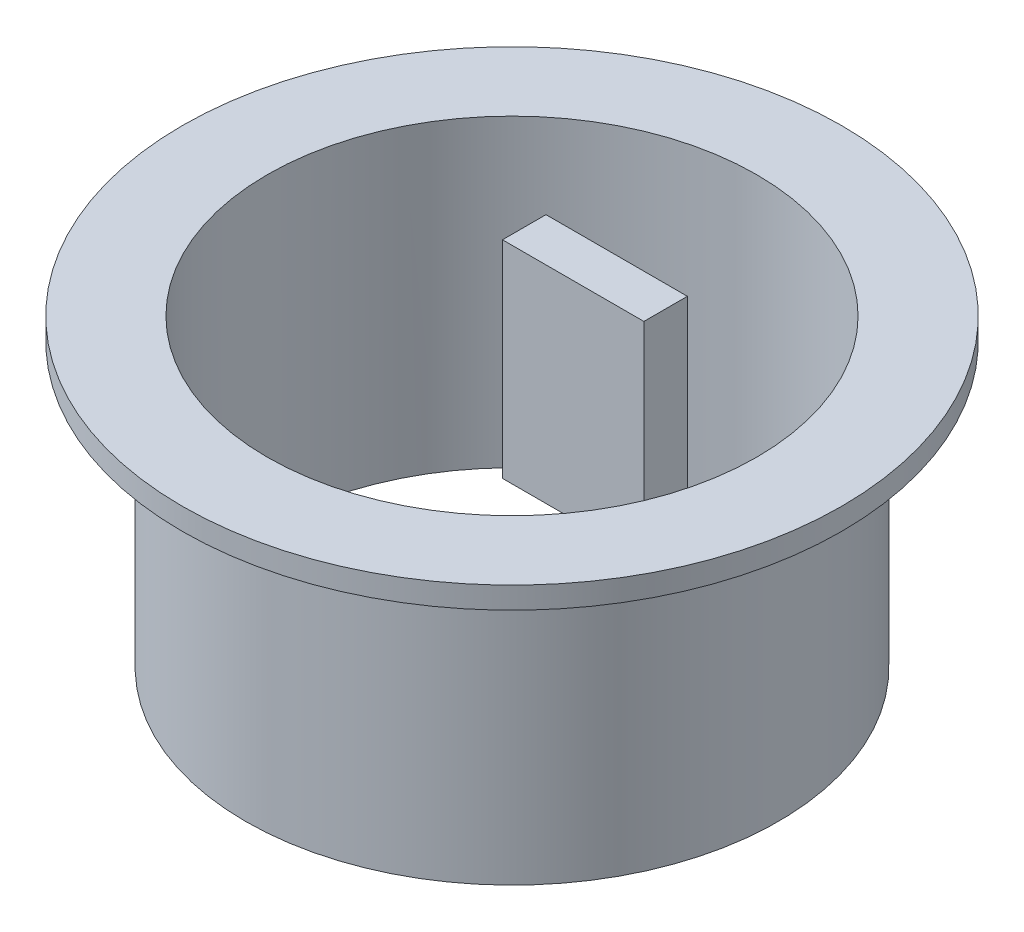
ISO-10303-21;
HEADER;
FILE_DESCRIPTION(('STEP AP214'),'2;1');
FILE_NAME('part.step','',(''),(''),'','','');
FILE_SCHEMA(('AUTOMOTIVE_DESIGN { 1 0 10303 214 1 1 1 1 }'));
ENDSEC;
DATA;
#1=APPLICATION_CONTEXT('core data for automotive mechanical design processes');
#2=APPLICATION_PROTOCOL_DEFINITION('international standard','automotive_design',2000,#1);
#3=PRODUCT_CONTEXT('',#1,'mechanical');
#4=PRODUCT('Part','Part','',(#3));
#5=PRODUCT_RELATED_PRODUCT_CATEGORY('part','',(#4));
#6=PRODUCT_DEFINITION_FORMATION('','',#4);
#7=PRODUCT_DEFINITION_CONTEXT('part definition',#1,'design');
#8=PRODUCT_DEFINITION('design','',#6,#7);
#9=PRODUCT_DEFINITION_SHAPE('','',#8);
#10=(LENGTH_UNIT() NAMED_UNIT(*) SI_UNIT(.MILLI.,.METRE.));
#11=(NAMED_UNIT(*) PLANE_ANGLE_UNIT() SI_UNIT($,.RADIAN.));
#12=(NAMED_UNIT(*) SI_UNIT($,.STERADIAN.) SOLID_ANGLE_UNIT());
#13=UNCERTAINTY_MEASURE_WITH_UNIT(LENGTH_MEASURE(1.E-05),#10,'distance_accuracy_value','');
#14=(GEOMETRIC_REPRESENTATION_CONTEXT(3) GLOBAL_UNCERTAINTY_ASSIGNED_CONTEXT((#13)) GLOBAL_UNIT_ASSIGNED_CONTEXT((#10,
#11,#12)) REPRESENTATION_CONTEXT('',''));
#15=CARTESIAN_POINT('',(0.,0.,0.));
#16=DIRECTION('',(0.,0.,1.));
#17=DIRECTION('',(1.,0.,0.));
#18=AXIS2_PLACEMENT_3D('',#15,#16,#17);
#19=CARTESIAN_POINT('',(13.,-34.,-11.25));
#20=DIRECTION('',(0.,1.,0.));
#21=DIRECTION('',(0.,0.,1.));
#22=AXIS2_PLACEMENT_3D('',#19,#20,#21);
#23=PLANE('',#22);
#24=DIRECTION('',(0.,0.,-1.));
#25=VECTOR('',#24,1.);
#26=CARTESIAN_POINT('',(-13.,-34.,-11.25));
#27=LINE('',#26,#25);
#28=CARTESIAN_POINT('',(-13.,-34.,-11.25));
#29=VERTEX_POINT('',#28);
#30=CARTESIAN_POINT('',(-13.,-34.,-19.25));
#31=VERTEX_POINT('',#30);
#32=EDGE_CURVE('E108',#29,#31,#27,.T.);
#33=ORIENTED_EDGE('',*,*,#32,.T.);
#34=DIRECTION('',(-1.,0.,0.));
#35=VECTOR('',#34,1.);
#36=CARTESIAN_POINT('',(13.,-34.,-19.25));
#37=LINE('',#36,#35);
#38=CARTESIAN_POINT('',(13.,-34.,-19.25));
#39=VERTEX_POINT('',#38);
#40=EDGE_CURVE('E12',#39,#31,#37,.T.);
#41=ORIENTED_EDGE('',*,*,#40,.F.);
#42=DIRECTION('',(0.,0.,-1.));
#43=VECTOR('',#42,1.);
#44=CARTESIAN_POINT('',(13.,-34.,-11.25));
#45=LINE('',#44,#43);
#46=CARTESIAN_POINT('',(13.,-34.,-11.25));
#47=VERTEX_POINT('',#46);
#48=EDGE_CURVE('E94',#47,#39,#45,.T.);
#49=ORIENTED_EDGE('',*,*,#48,.F.);
#50=DIRECTION('',(-1.,0.,0.));
#51=VECTOR('',#50,1.);
#52=CARTESIAN_POINT('',(13.,-34.,-11.25));
#53=LINE('',#52,#51);
#54=EDGE_CURVE('E61',#47,#29,#53,.T.);
#55=ORIENTED_EDGE('',*,*,#54,.T.);
#56=EDGE_LOOP('',(#33,#41,#49,#55));
#57=FACE_BOUND('',#56,.T.);
#58=ADVANCED_FACE('F45',(#57),#23,.F.);
#59=CARTESIAN_POINT('',(13.,-34.,-19.25));
#60=DIRECTION('',(0.,0.,1.));
#61=DIRECTION('',(0.,-1.,0.));
#62=AXIS2_PLACEMENT_3D('',#59,#60,#61);
#63=PLANE('',#62);
#64=DIRECTION('',(0.,1.,0.));
#65=VECTOR('',#64,1.);
#66=CARTESIAN_POINT('',(-13.,-34.,-19.25));
#67=LINE('',#66,#65);
#68=CARTESIAN_POINT('',(-13.,4.,-19.25));
#69=VERTEX_POINT('',#68);
#70=EDGE_CURVE('E99',#31,#69,#67,.T.);
#71=ORIENTED_EDGE('',*,*,#70,.T.);
#72=DIRECTION('',(-1.,0.,0.));
#73=VECTOR('',#72,1.);
#74=CARTESIAN_POINT('',(13.,4.,-19.25));
#75=LINE('',#74,#73);
#76=CARTESIAN_POINT('',(13.,4.,-19.25));
#77=VERTEX_POINT('',#76);
#78=EDGE_CURVE('E53',#77,#69,#75,.T.);
#79=ORIENTED_EDGE('',*,*,#78,.F.);
#80=DIRECTION('',(0.,1.,0.));
#81=VECTOR('',#80,1.);
#82=CARTESIAN_POINT('',(13.,-34.,-19.25));
#83=LINE('',#82,#81);
#84=EDGE_CURVE('E86',#39,#77,#83,.T.);
#85=ORIENTED_EDGE('',*,*,#84,.F.);
#86=ORIENTED_EDGE('',*,*,#40,.T.);
#87=EDGE_LOOP('',(#71,#79,#85,#86));
#88=FACE_BOUND('',#87,.T.);
#89=ADVANCED_FACE('F98',(#88),#63,.F.);
#90=CARTESIAN_POINT('',(13.,4.,-11.25));
#91=DIRECTION('',(0.,1.,0.));
#92=DIRECTION('',(0.,0.,1.));
#93=AXIS2_PLACEMENT_3D('',#90,#91,#92);
#94=PLANE('',#93);
#95=DIRECTION('',(0.,0.,-1.));
#96=VECTOR('',#95,1.);
#97=CARTESIAN_POINT('',(-13.,4.,-11.25));
#98=LINE('',#97,#96);
#99=CARTESIAN_POINT('',(-13.,4.,-11.25));
#100=VERTEX_POINT('',#99);
#101=EDGE_CURVE('E111',#100,#69,#98,.T.);
#102=ORIENTED_EDGE('',*,*,#101,.F.);
#103=DIRECTION('',(-1.,0.,0.));
#104=VECTOR('',#103,1.);
#105=CARTESIAN_POINT('',(13.,4.,-11.25));
#106=LINE('',#105,#104);
#107=CARTESIAN_POINT('',(13.,4.,-11.25));
#108=VERTEX_POINT('',#107);
#109=EDGE_CURVE('E75',#108,#100,#106,.T.);
#110=ORIENTED_EDGE('',*,*,#109,.F.);
#111=DIRECTION('',(0.,0.,-1.));
#112=VECTOR('',#111,1.);
#113=CARTESIAN_POINT('',(13.,4.,-11.25));
#114=LINE('',#113,#112);
#115=EDGE_CURVE('E93',#108,#77,#114,.T.);
#116=ORIENTED_EDGE('',*,*,#115,.T.);
#117=ORIENTED_EDGE('',*,*,#78,.T.);
#118=EDGE_LOOP('',(#102,#110,#116,#117));
#119=FACE_BOUND('',#118,.T.);
#120=ADVANCED_FACE('F102',(#119),#94,.T.);
#121=CARTESIAN_POINT('',(13.,-34.,-11.25));
#122=DIRECTION('',(0.,0.,1.));
#123=DIRECTION('',(1.,0.,0.));
#124=AXIS2_PLACEMENT_3D('',#121,#122,#123);
#125=PLANE('',#124);
#126=DIRECTION('',(0.,1.,0.));
#127=VECTOR('',#126,1.);
#128=CARTESIAN_POINT('',(-13.,-34.,-11.25));
#129=LINE('',#128,#127);
#130=EDGE_CURVE('E113',#29,#100,#129,.T.);
#131=ORIENTED_EDGE('',*,*,#130,.F.);
#132=ORIENTED_EDGE('',*,*,#54,.F.);
#133=DIRECTION('',(0.,1.,0.));
#134=VECTOR('',#133,1.);
#135=CARTESIAN_POINT('',(13.,-34.,-11.25));
#136=LINE('',#135,#134);
#137=EDGE_CURVE('E103',#47,#108,#136,.T.);
#138=ORIENTED_EDGE('',*,*,#137,.T.);
#139=ORIENTED_EDGE('',*,*,#109,.T.);
#140=EDGE_LOOP('',(#131,#132,#138,#139));
#141=FACE_BOUND('',#140,.T.);
#142=ADVANCED_FACE('F119',(#141),#125,.T.);
#143=CARTESIAN_POINT('',(13.,0.,0.));
#144=DIRECTION('',(1.,0.,0.));
#145=DIRECTION('',(0.,0.,-1.));
#146=AXIS2_PLACEMENT_3D('',#143,#144,#145);
#147=PLANE('',#146);
#148=ORIENTED_EDGE('',*,*,#48,.T.);
#149=ORIENTED_EDGE('',*,*,#84,.T.);
#150=ORIENTED_EDGE('',*,*,#115,.F.);
#151=ORIENTED_EDGE('',*,*,#137,.F.);
#152=EDGE_LOOP('',(#148,#149,#150,#151));
#153=FACE_BOUND('',#152,.T.);
#154=ADVANCED_FACE('F90',(#153),#147,.T.);
#155=CARTESIAN_POINT('',(-13.,0.,0.));
#156=DIRECTION('',(1.,0.,0.));
#157=DIRECTION('',(0.,0.,-1.));
#158=AXIS2_PLACEMENT_3D('',#155,#156,#157);
#159=PLANE('',#158);
#160=ORIENTED_EDGE('',*,*,#32,.F.);
#161=ORIENTED_EDGE('',*,*,#130,.T.);
#162=ORIENTED_EDGE('',*,*,#101,.T.);
#163=ORIENTED_EDGE('',*,*,#70,.F.);
#164=EDGE_LOOP('',(#160,#161,#162,#163));
#165=FACE_BOUND('',#164,.T.);
#166=ADVANCED_FACE('F118',(#165),#159,.F.);
#167=CLOSED_SHELL('',(#58,#89,#120,#142,#154,#166));
#168=MANIFOLD_SOLID_BREP('B2',#167);
#169=CARTESIAN_POINT('',(0.,0.,0.));
#170=DIRECTION('',(0.,1.,0.));
#171=DIRECTION('',(0.,0.,1.));
#172=AXIS2_PLACEMENT_3D('',#169,#170,#171);
#173=PLANE('',#172);
#174=CARTESIAN_POINT('',(0.,0.,0.));
#175=DIRECTION('',(0.,1.,0.));
#176=DIRECTION('',(0.,0.,1.));
#177=AXIS2_PLACEMENT_3D('',#174,#175,#176);
#178=CIRCLE('',#177,60.625);
#179=CARTESIAN_POINT('',(0.,0.,60.625));
#180=VERTEX_POINT('',#179);
#181=EDGE_CURVE('E248',#180,#180,#178,.T.);
#182=ORIENTED_EDGE('',*,*,#181,.F.);
#183=EDGE_LOOP('',(#182));
#184=FACE_BOUND('',#183,.T.);
#185=CARTESIAN_POINT('',(0.,0.,0.));
#186=DIRECTION('',(0.,1.,0.));
#187=DIRECTION('',(0.,0.,1.));
#188=AXIS2_PLACEMENT_3D('',#185,#186,#187);
#189=CIRCLE('',#188,49.);
#190=CARTESIAN_POINT('',(0.,0.,49.));
#191=VERTEX_POINT('',#190);
#192=EDGE_CURVE('E252',#191,#191,#189,.F.);
#193=ORIENTED_EDGE('',*,*,#192,.F.);
#194=EDGE_LOOP('',(#193));
#195=FACE_BOUND('',#194,.T.);
#196=ADVANCED_FACE('F169',(#184,#195),#173,.F.);
#197=CARTESIAN_POINT('',(0.,4.,0.));
#198=DIRECTION('',(0.,1.,0.));
#199=DIRECTION('',(0.,0.,1.));
#200=AXIS2_PLACEMENT_3D('',#197,#198,#199);
#201=PLANE('',#200);
#202=CARTESIAN_POINT('',(0.,4.,0.));
#203=DIRECTION('',(0.,1.,0.));
#204=DIRECTION('',(0.,0.,1.));
#205=AXIS2_PLACEMENT_3D('',#202,#203,#204);
#206=CIRCLE('',#205,60.625);
#207=CARTESIAN_POINT('',(0.,4.,60.625));
#208=VERTEX_POINT('',#207);
#209=EDGE_CURVE('E249',#208,#208,#206,.T.);
#210=ORIENTED_EDGE('',*,*,#209,.T.);
#211=EDGE_LOOP('',(#210));
#212=FACE_BOUND('',#211,.T.);
#213=CARTESIAN_POINT('',(0.,4.,0.));
#214=DIRECTION('',(0.,1.,0.));
#215=DIRECTION('',(0.,0.,1.));
#216=AXIS2_PLACEMENT_3D('',#213,#214,#215);
#217=CIRCLE('',#216,45.);
#218=CARTESIAN_POINT('',(0.,4.,45.));
#219=VERTEX_POINT('',#218);
#220=EDGE_CURVE('E245',#219,#219,#217,.T.);
#221=ORIENTED_EDGE('',*,*,#220,.F.);
#222=EDGE_LOOP('',(#221));
#223=FACE_BOUND('',#222,.T.);
#224=ADVANCED_FACE('F275',(#212,#223),#201,.T.);
#225=CARTESIAN_POINT('',(0.,4.,0.));
#226=DIRECTION('',(0.,-1.,0.));
#227=DIRECTION('',(0.,0.,-1.));
#228=AXIS2_PLACEMENT_3D('',#225,#226,#227);
#229=CYLINDRICAL_SURFACE('',#228,60.625);
#230=ORIENTED_EDGE('',*,*,#209,.F.);
#231=EDGE_LOOP('',(#230));
#232=FACE_BOUND('',#231,.T.);
#233=ORIENTED_EDGE('',*,*,#181,.T.);
#234=EDGE_LOOP('',(#233));
#235=FACE_BOUND('',#234,.T.);
#236=ADVANCED_FACE('F171',(#232,#235),#229,.T.);
#237=CARTESIAN_POINT('',(0.,4.,0.));
#238=DIRECTION('',(0.,-1.,0.));
#239=DIRECTION('',(0.,0.,-1.));
#240=AXIS2_PLACEMENT_3D('',#237,#238,#239);
#241=CYLINDRICAL_SURFACE('',#240,45.);
#242=DIRECTION('',(0.,-1.,0.));
#243=VECTOR('',#242,1.);
#244=CARTESIAN_POINT('',(13.,4.,43.081318457076));
#245=LINE('',#244,#243);
#246=CARTESIAN_POINT('',(13.,-24.2896123083659,43.081318457076));
#247=VERTEX_POINT('',#246);
#248=CARTESIAN_POINT('',(13.,-34.,43.081318457076));
#249=VERTEX_POINT('',#248);
#250=EDGE_CURVE('E43',#247,#249,#245,.T.);
#251=ORIENTED_EDGE('',*,*,#250,.F.);
#252=CARTESIAN_POINT('',(0.,-30.7924528301887,0.));
#253=DIRECTION('',(0.,-0.988799086686588,0.149252692330052));
#254=DIRECTION('',(0.,-0.149252692330052,-0.988799086686588));
#255=AXIS2_PLACEMENT_3D('',#252,#253,#254);
#256=ELLIPSE('',#255,45.509750773327,45.);
#257=CARTESIAN_POINT('',(-13.,-24.2896123083659,43.081318457076));
#258=VERTEX_POINT('',#257);
#259=EDGE_CURVE('E186',#247,#258,#256,.T.);
#260=ORIENTED_EDGE('',*,*,#259,.T.);
#261=DIRECTION('',(0.,-1.,0.));
#262=VECTOR('',#261,1.);
#263=CARTESIAN_POINT('',(-13.,4.,43.081318457076));
#264=LINE('',#263,#262);
#265=CARTESIAN_POINT('',(-13.,-34.,43.081318457076));
#266=VERTEX_POINT('',#265);
#267=EDGE_CURVE('E257',#258,#266,#264,.T.);
#268=ORIENTED_EDGE('',*,*,#267,.T.);
#269=CARTESIAN_POINT('',(0.,-34.,0.));
#270=DIRECTION('',(0.,1.,0.));
#271=DIRECTION('',(0.,0.,1.));
#272=AXIS2_PLACEMENT_3D('',#269,#270,#271);
#273=CIRCLE('',#272,45.);
#274=EDGE_CURVE('E177',#266,#249,#273,.T.);
#275=ORIENTED_EDGE('',*,*,#274,.T.);
#276=EDGE_LOOP('',(#251,#260,#268,#275));
#277=FACE_BOUND('',#276,.T.);
#278=ORIENTED_EDGE('',*,*,#220,.T.);
#279=EDGE_LOOP('',(#278));
#280=FACE_BOUND('',#279,.T.);
#281=CARTESIAN_POINT('',(0.,-52.,0.));
#282=DIRECTION('',(0.,-1.,0.));
#283=DIRECTION('',(0.,0.,-1.));
#284=AXIS2_PLACEMENT_3D('',#281,#282,#283);
#285=CIRCLE('',#284,45.);
#286=CARTESIAN_POINT('',(0.,-52.,-45.));
#287=VERTEX_POINT('',#286);
#288=EDGE_CURVE('E227',#287,#287,#285,.T.);
#289=ORIENTED_EDGE('',*,*,#288,.T.);
#290=EDGE_LOOP('',(#289));
#291=FACE_BOUND('',#290,.T.);
#292=ADVANCED_FACE('F259',(#277,#280,#291),#241,.F.);
#293=CARTESIAN_POINT('',(0.,-52.,0.));
#294=DIRECTION('',(0.,-1.,0.));
#295=DIRECTION('',(0.,0.,-1.));
#296=AXIS2_PLACEMENT_3D('',#293,#294,#295);
#297=PLANE('',#296);
#298=CARTESIAN_POINT('',(0.,-52.,0.));
#299=DIRECTION('',(0.,-1.,0.));
#300=DIRECTION('',(0.,0.,-1.));
#301=AXIS2_PLACEMENT_3D('',#298,#299,#300);
#302=CIRCLE('',#301,49.);
#303=CARTESIAN_POINT('',(0.,-52.,49.));
#304=VERTEX_POINT('',#303);
#305=EDGE_CURVE('E242',#304,#304,#302,.T.);
#306=ORIENTED_EDGE('',*,*,#305,.T.);
#307=EDGE_LOOP('',(#306));
#308=FACE_BOUND('',#307,.T.);
#309=ORIENTED_EDGE('',*,*,#288,.F.);
#310=EDGE_LOOP('',(#309));
#311=FACE_BOUND('',#310,.T.);
#312=ADVANCED_FACE('F287',(#308,#311),#297,.T.);
#313=CARTESIAN_POINT('',(0.,-52.,0.));
#314=DIRECTION('',(0.,1.,0.));
#315=DIRECTION('',(0.,0.,1.));
#316=AXIS2_PLACEMENT_3D('',#313,#314,#315);
#317=CYLINDRICAL_SURFACE('',#316,49.);
#318=CARTESIAN_POINT('',(0.,-52.,49.));
#319=CARTESIAN_POINT('',(0.,-51.4583333333333,49.));
#320=CARTESIAN_POINT('',(0.,-50.9166666666667,49.));
#321=CARTESIAN_POINT('',(0.,-49.8333333333333,49.));
#322=CARTESIAN_POINT('',(0.,-49.2916666666667,49.));
#323=CARTESIAN_POINT('',(0.,-48.2083333333333,49.));
#324=CARTESIAN_POINT('',(0.,-47.6666666666667,49.));
#325=CARTESIAN_POINT('',(0.,-46.5833333333333,49.));
#326=CARTESIAN_POINT('',(0.,-46.0416666666667,49.));
#327=CARTESIAN_POINT('',(0.,-44.9583333333333,49.));
#328=CARTESIAN_POINT('',(0.,-44.4166666666667,49.));
#329=CARTESIAN_POINT('',(0.,-43.3333333333333,49.));
#330=CARTESIAN_POINT('',(0.,-42.7916666666667,49.));
#331=CARTESIAN_POINT('',(0.,-41.7083333333333,49.));
#332=CARTESIAN_POINT('',(0.,-41.1666666666667,49.));
#333=CARTESIAN_POINT('',(0.,-40.0833333333333,49.));
#334=CARTESIAN_POINT('',(0.,-39.5416666666667,49.));
#335=CARTESIAN_POINT('',(0.,-38.4583333333333,49.));
#336=CARTESIAN_POINT('',(0.,-37.9166666666667,49.));
#337=CARTESIAN_POINT('',(0.,-36.8333333333333,49.));
#338=CARTESIAN_POINT('',(0.,-36.2916666666667,49.));
#339=CARTESIAN_POINT('',(0.,-35.2083333333333,49.));
#340=CARTESIAN_POINT('',(0.,-34.6666666666667,49.));
#341=CARTESIAN_POINT('',(0.,-33.5833333333333,49.));
#342=CARTESIAN_POINT('',(0.,-33.0416666666667,49.));
#343=CARTESIAN_POINT('',(0.,-31.9583333333333,49.));
#344=CARTESIAN_POINT('',(0.,-31.4166666666667,49.));
#345=CARTESIAN_POINT('',(0.,-30.3333333333333,49.));
#346=CARTESIAN_POINT('',(0.,-29.7916666666667,49.));
#347=CARTESIAN_POINT('',(0.,-28.7083333333333,49.));
#348=CARTESIAN_POINT('',(0.,-28.1666666666667,49.));
#349=CARTESIAN_POINT('',(0.,-27.0833333333333,49.));
#350=CARTESIAN_POINT('',(0.,-26.5416666666667,49.));
#351=CARTESIAN_POINT('',(0.,-25.4583333333333,49.));
#352=CARTESIAN_POINT('',(0.,-24.9166666666667,49.));
#353=CARTESIAN_POINT('',(0.,-23.8333333333333,49.));
#354=CARTESIAN_POINT('',(0.,-23.2916666666667,49.));
#355=CARTESIAN_POINT('',(0.,-22.2083333333333,49.));
#356=CARTESIAN_POINT('',(0.,-21.6666666666667,49.));
#357=CARTESIAN_POINT('',(0.,-20.5833333333333,49.));
#358=CARTESIAN_POINT('',(0.,-20.0416666666667,49.));
#359=CARTESIAN_POINT('',(0.,-18.9583333333333,49.));
#360=CARTESIAN_POINT('',(0.,-18.4166666666667,49.));
#361=CARTESIAN_POINT('',(0.,-17.3333333333333,49.));
#362=CARTESIAN_POINT('',(0.,-16.7916666666667,49.));
#363=CARTESIAN_POINT('',(0.,-15.7083333333333,49.));
#364=CARTESIAN_POINT('',(0.,-15.1666666666667,49.));
#365=CARTESIAN_POINT('',(0.,-14.0833333333333,49.));
#366=CARTESIAN_POINT('',(0.,-13.5416666666667,49.));
#367=CARTESIAN_POINT('',(0.,-12.4583333333333,49.));
#368=CARTESIAN_POINT('',(0.,-11.9166666666667,49.));
#369=CARTESIAN_POINT('',(0.,-10.8333333333333,49.));
#370=CARTESIAN_POINT('',(0.,-10.2916666666667,49.));
#371=CARTESIAN_POINT('',(0.,-9.20833333333333,49.));
#372=CARTESIAN_POINT('',(0.,-8.66666666666667,49.));
#373=CARTESIAN_POINT('',(0.,-7.58333333333333,49.));
#374=CARTESIAN_POINT('',(0.,-7.04166666666667,49.));
#375=CARTESIAN_POINT('',(0.,-5.95833333333333,49.));
#376=CARTESIAN_POINT('',(0.,-5.41666666666667,49.));
#377=CARTESIAN_POINT('',(0.,-4.33333333333333,49.));
#378=CARTESIAN_POINT('',(0.,-3.79166666666667,49.));
#379=CARTESIAN_POINT('',(0.,-2.70833333333334,49.));
#380=CARTESIAN_POINT('',(0.,-2.16666666666667,49.));
#381=CARTESIAN_POINT('',(0.,-1.08333333333333,49.));
#382=CARTESIAN_POINT('',(0.,-0.541666666666667,49.));
#383=CARTESIAN_POINT('',(0.,0.,49.));
#384=B_SPLINE_CURVE_WITH_KNOTS('',3,(#318,#319,#320,#321,#322,#323,#324,#325,#326,#327,#328,
#329,#330,#331,#332,#333,#334,#335,#336,#337,#338,#339,#340,#341,#342,#343,#344,#345,#346,#347,
#348,#349,#350,#351,#352,#353,#354,#355,#356,#357,#358,#359,#360,#361,#362,#363,#364,#365,#366,
#367,#368,#369,#370,#371,#372,#373,#374,#375,#376,#377,#378,#379,#380,#381,#382,#383),
.UNSPECIFIED.,.F.,.F.,(4,2,2,2,2,2,2,2,2,2,2,2,2,2,2,2,2,2,2,2,2,2,2,2,2,2,2,2,2,2,2,2,4),(0.,
1.625,3.25,4.875,6.50000000000001,8.125,9.75,11.375,13.,14.625,16.25,17.875,19.5,21.125,22.75,
24.375,26.,27.625,29.25,30.875,32.5,34.125,35.75,37.375,39.,40.625,42.25,43.875,45.5,47.125,
48.75,50.375,52.),.UNSPECIFIED.);
#385=EDGE_CURVE('BSEAM288',#304,#191,#384,.T.);
#386=ORIENTED_EDGE('',*,*,#305,.F.);
#387=ORIENTED_EDGE('',*,*,#192,.T.);
#388=ORIENTED_EDGE('',*,*,#385,.T.);
#389=ORIENTED_EDGE('',*,*,#385,.F.);
#390=EDGE_LOOP('',(#386,#388,#387,#389));
#391=FACE_BOUND('',#390,.T.);
#392=ADVANCED_FACE('F288',(#391),#317,.T.);
#393=CARTESIAN_POINT('',(13.,-34.,46.75));
#394=DIRECTION('',(0.,1.,0.));
#395=DIRECTION('',(0.,0.,1.));
#396=AXIS2_PLACEMENT_3D('',#393,#394,#395);
#397=PLANE('',#396);
#398=ORIENTED_EDGE('',*,*,#274,.F.);
#399=DIRECTION('',(0.,0.,-1.));
#400=VECTOR('',#399,1.);
#401=CARTESIAN_POINT('',(-13.,-34.,46.75));
#402=LINE('',#401,#400);
#403=CARTESIAN_POINT('',(-13.,-34.,31.75));
#404=VERTEX_POINT('',#403);
#405=EDGE_CURVE('E217',#266,#404,#402,.T.);
#406=ORIENTED_EDGE('',*,*,#405,.T.);
#407=DIRECTION('',(-1.,0.,0.));
#408=VECTOR('',#407,1.);
#409=CARTESIAN_POINT('',(13.,-34.,31.75));
#410=LINE('',#409,#408);
#411=CARTESIAN_POINT('',(13.,-34.,31.75));
#412=VERTEX_POINT('',#411);
#413=EDGE_CURVE('E228',#412,#404,#410,.T.);
#414=ORIENTED_EDGE('',*,*,#413,.F.);
#415=DIRECTION('',(0.,0.,-1.));
#416=VECTOR('',#415,1.);
#417=CARTESIAN_POINT('',(13.,-34.,46.75));
#418=LINE('',#417,#416);
#419=EDGE_CURVE('E213',#249,#412,#418,.T.);
#420=ORIENTED_EDGE('',*,*,#419,.F.);
#421=EDGE_LOOP('',(#398,#406,#414,#420));
#422=FACE_BOUND('',#421,.T.);
#423=ADVANCED_FACE('F262',(#422),#397,.F.);
#424=CARTESIAN_POINT('',(13.,-34.,31.75));
#425=DIRECTION('',(0.,0.,1.));
#426=DIRECTION('',(1.,0.,0.));
#427=AXIS2_PLACEMENT_3D('',#424,#425,#426);
#428=PLANE('',#427);
#429=DIRECTION('',(0.,1.,0.));
#430=VECTOR('',#429,1.);
#431=CARTESIAN_POINT('',(-13.,-34.,31.75));
#432=LINE('',#431,#430);
#433=CARTESIAN_POINT('',(-13.,-26.,31.75));
#434=VERTEX_POINT('',#433);
#435=EDGE_CURVE('E223',#404,#434,#432,.T.);
#436=ORIENTED_EDGE('',*,*,#435,.T.);
#437=DIRECTION('',(-1.,0.,0.));
#438=VECTOR('',#437,1.);
#439=CARTESIAN_POINT('',(13.,-26.,31.75));
#440=LINE('',#439,#438);
#441=CARTESIAN_POINT('',(13.,-26.,31.75));
#442=VERTEX_POINT('',#441);
#443=EDGE_CURVE('E220',#442,#434,#440,.T.);
#444=ORIENTED_EDGE('',*,*,#443,.F.);
#445=DIRECTION('',(0.,1.,0.));
#446=VECTOR('',#445,1.);
#447=CARTESIAN_POINT('',(13.,-34.,31.75));
#448=LINE('',#447,#446);
#449=EDGE_CURVE('E207',#412,#442,#448,.T.);
#450=ORIENTED_EDGE('',*,*,#449,.F.);
#451=ORIENTED_EDGE('',*,*,#413,.T.);
#452=EDGE_LOOP('',(#436,#444,#450,#451));
#453=FACE_BOUND('',#452,.T.);
#454=ADVANCED_FACE('F221',(#453),#428,.F.);
#455=CARTESIAN_POINT('',(13.,0.,0.));
#456=DIRECTION('',(1.,0.,0.));
#457=DIRECTION('',(0.,0.,-1.));
#458=AXIS2_PLACEMENT_3D('',#455,#456,#457);
#459=PLANE('',#458);
#460=ORIENTED_EDGE('',*,*,#449,.T.);
#461=DIRECTION('',(0.,0.149252692330052,0.988799086686588));
#462=VECTOR('',#461,1.);
#463=CARTESIAN_POINT('',(13.,-30.1065088757397,4.54437869822488));
#464=LINE('',#463,#462);
#465=EDGE_CURVE('E211',#442,#247,#464,.T.);
#466=ORIENTED_EDGE('',*,*,#465,.T.);
#467=ORIENTED_EDGE('',*,*,#250,.T.);
#468=ORIENTED_EDGE('',*,*,#419,.T.);
#469=EDGE_LOOP('',(#460,#466,#467,#468));
#470=FACE_BOUND('',#469,.T.);
#471=ADVANCED_FACE('F209',(#470),#459,.T.);
#472=CARTESIAN_POINT('',(-13.,0.,0.));
#473=DIRECTION('',(1.,0.,0.));
#474=DIRECTION('',(0.,0.,-1.));
#475=AXIS2_PLACEMENT_3D('',#472,#473,#474);
#476=PLANE('',#475);
#477=ORIENTED_EDGE('',*,*,#267,.F.);
#478=DIRECTION('',(0.,0.149252692330052,0.988799086686588));
#479=VECTOR('',#478,1.);
#480=CARTESIAN_POINT('',(-13.,-30.1065088757397,4.54437869822488));
#481=LINE('',#480,#479);
#482=EDGE_CURVE('E231',#434,#258,#481,.T.);
#483=ORIENTED_EDGE('',*,*,#482,.F.);
#484=ORIENTED_EDGE('',*,*,#435,.F.);
#485=ORIENTED_EDGE('',*,*,#405,.F.);
#486=EDGE_LOOP('',(#477,#483,#484,#485));
#487=FACE_BOUND('',#486,.T.);
#488=ADVANCED_FACE('F264',(#487),#476,.F.);
#489=CARTESIAN_POINT('',(13.,-30.1065088757397,4.54437869822488));
#490=DIRECTION('',(0.,-0.988799086686588,0.149252692330052));
#491=DIRECTION('',(0.,-0.149252692330052,-0.988799086686588));
#492=AXIS2_PLACEMENT_3D('',#489,#490,#491);
#493=PLANE('',#492);
#494=ORIENTED_EDGE('',*,*,#259,.F.);
#495=ORIENTED_EDGE('',*,*,#465,.F.);
#496=ORIENTED_EDGE('',*,*,#443,.T.);
#497=ORIENTED_EDGE('',*,*,#482,.T.);
#498=EDGE_LOOP('',(#494,#495,#496,#497));
#499=FACE_BOUND('',#498,.T.);
#500=ADVANCED_FACE('F230',(#499),#493,.F.);
#501=CLOSED_SHELL('',(#196,#224,#236,#292,#312,#392,#423,#454,#471,#488,#500));
#502=MANIFOLD_SOLID_BREP('B6',#501);
#503=ADVANCED_BREP_SHAPE_REPRESENTATION('',(#18,#168,#502),#14);
#504=SHAPE_DEFINITION_REPRESENTATION(#9,#503);
ENDSEC;
END-ISO-10303-21;
